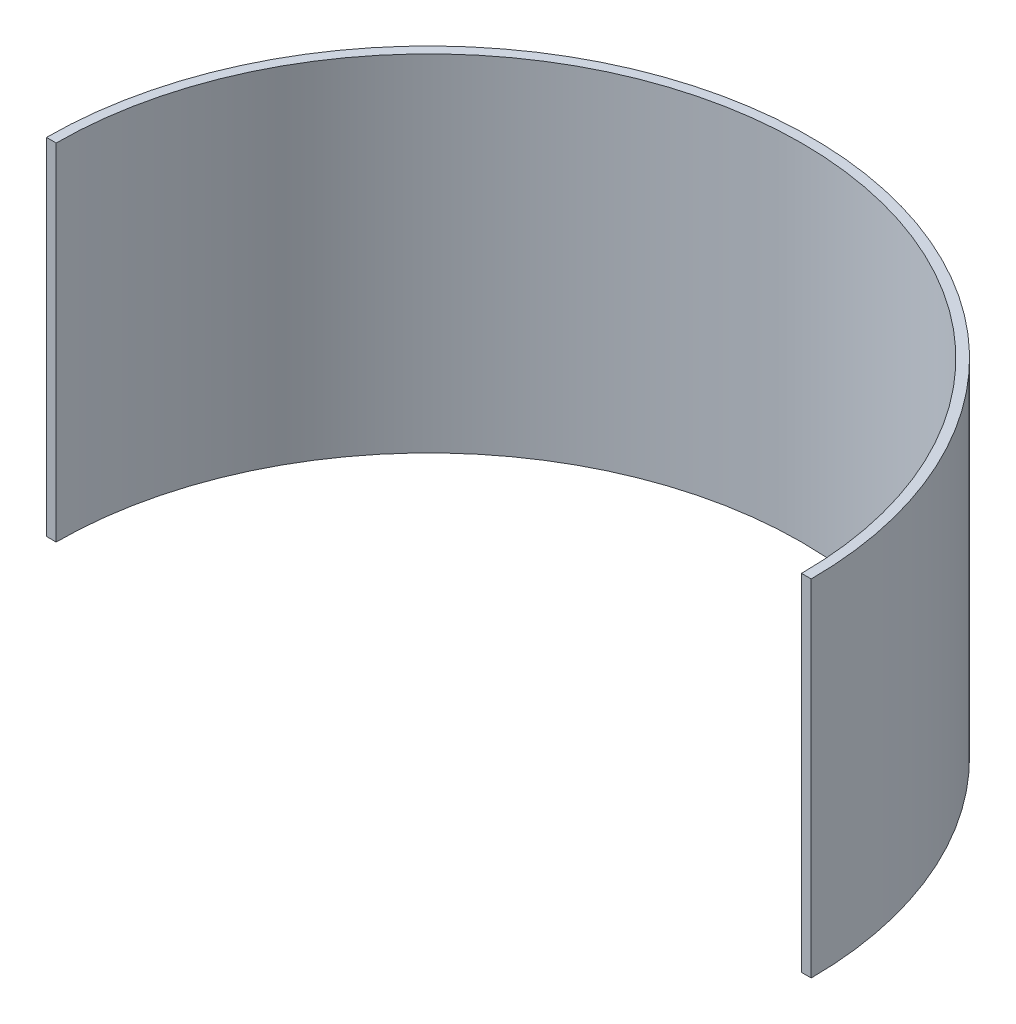
ISO-10303-21;
HEADER;
FILE_DESCRIPTION(('STEP AP214'),'2;1');
FILE_NAME('part.step','',(''),(''),'','','');
FILE_SCHEMA(('AUTOMOTIVE_DESIGN { 1 0 10303 214 1 1 1 1 }'));
ENDSEC;
DATA;
#1=APPLICATION_CONTEXT('core data for automotive mechanical design processes');
#2=APPLICATION_PROTOCOL_DEFINITION('international standard','automotive_design',2000,#1);
#3=PRODUCT_CONTEXT('',#1,'mechanical');
#4=PRODUCT('Part','Part','',(#3));
#5=PRODUCT_RELATED_PRODUCT_CATEGORY('part','',(#4));
#6=PRODUCT_DEFINITION_FORMATION('','',#4);
#7=PRODUCT_DEFINITION_CONTEXT('part definition',#1,'design');
#8=PRODUCT_DEFINITION('design','',#6,#7);
#9=PRODUCT_DEFINITION_SHAPE('','',#8);
#10=(LENGTH_UNIT() NAMED_UNIT(*) SI_UNIT(.MILLI.,.METRE.));
#11=(NAMED_UNIT(*) PLANE_ANGLE_UNIT() SI_UNIT($,.RADIAN.));
#12=(NAMED_UNIT(*) SI_UNIT($,.STERADIAN.) SOLID_ANGLE_UNIT());
#13=UNCERTAINTY_MEASURE_WITH_UNIT(LENGTH_MEASURE(1.E-05),#10,'distance_accuracy_value','');
#14=(GEOMETRIC_REPRESENTATION_CONTEXT(3) GLOBAL_UNCERTAINTY_ASSIGNED_CONTEXT((#13)) GLOBAL_UNIT_ASSIGNED_CONTEXT((#10,
#11,#12)) REPRESENTATION_CONTEXT('',''));
#15=CARTESIAN_POINT('',(0.,0.,0.));
#16=DIRECTION('',(0.,0.,1.));
#17=DIRECTION('',(1.,0.,0.));
#18=AXIS2_PLACEMENT_3D('',#15,#16,#17);
#19=CARTESIAN_POINT('',(0.,24.9,0.));
#20=DIRECTION('',(0.,-1.,0.));
#21=DIRECTION('',(0.,0.,-1.));
#22=AXIS2_PLACEMENT_3D('',#19,#20,#21);
#23=CYLINDRICAL_SURFACE('',#22,26.852);
#24=CARTESIAN_POINT('',(0.,0.,0.));
#25=DIRECTION('',(0.,1.,0.));
#26=DIRECTION('',(0.,0.,1.));
#27=AXIS2_PLACEMENT_3D('',#24,#25,#26);
#28=CIRCLE('',#27,26.852);
#29=CARTESIAN_POINT('',(26.852,0.,0.));
#30=VERTEX_POINT('',#29);
#31=CARTESIAN_POINT('',(-26.852,0.,0.));
#32=VERTEX_POINT('',#31);
#33=EDGE_CURVE('E111',#30,#32,#28,.T.);
#34=ORIENTED_EDGE('',*,*,#33,.F.);
#35=DIRECTION('',(0.,-1.,0.));
#36=VECTOR('',#35,1.);
#37=CARTESIAN_POINT('',(26.852,24.9,0.));
#38=LINE('',#37,#36);
#39=CARTESIAN_POINT('',(26.852,24.9,0.));
#40=VERTEX_POINT('',#39);
#41=EDGE_CURVE('E11',#40,#30,#38,.T.);
#42=ORIENTED_EDGE('',*,*,#41,.F.);
#43=CARTESIAN_POINT('',(0.,24.9,0.));
#44=DIRECTION('',(0.,1.,0.));
#45=DIRECTION('',(0.,0.,1.));
#46=AXIS2_PLACEMENT_3D('',#43,#44,#45);
#47=CIRCLE('',#46,26.852);
#48=CARTESIAN_POINT('',(-26.852,24.9,0.));
#49=VERTEX_POINT('',#48);
#50=EDGE_CURVE('E96',#40,#49,#47,.T.);
#51=ORIENTED_EDGE('',*,*,#50,.T.);
#52=DIRECTION('',(0.,-1.,0.));
#53=VECTOR('',#52,1.);
#54=CARTESIAN_POINT('',(-26.852,24.9,0.));
#55=LINE('',#54,#53);
#56=EDGE_CURVE('E85',#49,#32,#55,.T.);
#57=ORIENTED_EDGE('',*,*,#56,.T.);
#58=EDGE_LOOP('',(#34,#42,#51,#57));
#59=FACE_BOUND('',#58,.T.);
#60=ADVANCED_FACE('F45',(#59),#23,.F.);
#61=CARTESIAN_POINT('',(0.,24.9,0.));
#62=DIRECTION('',(0.,0.,-1.));
#63=DIRECTION('',(-1.,0.,0.));
#64=AXIS2_PLACEMENT_3D('',#61,#62,#63);
#65=PLANE('',#64);
#66=DIRECTION('',(1.,0.,0.));
#67=VECTOR('',#66,1.);
#68=CARTESIAN_POINT('',(0.,0.,0.));
#69=LINE('',#68,#67);
#70=CARTESIAN_POINT('',(27.55,0.,0.));
#71=VERTEX_POINT('',#70);
#72=EDGE_CURVE('E102',#30,#71,#69,.T.);
#73=ORIENTED_EDGE('',*,*,#72,.T.);
#74=DIRECTION('',(0.,-1.,0.));
#75=VECTOR('',#74,1.);
#76=CARTESIAN_POINT('',(27.55,24.9,0.));
#77=LINE('',#76,#75);
#78=CARTESIAN_POINT('',(27.55,24.9,0.));
#79=VERTEX_POINT('',#78);
#80=EDGE_CURVE('E54',#79,#71,#77,.T.);
#81=ORIENTED_EDGE('',*,*,#80,.F.);
#82=DIRECTION('',(1.,0.,0.));
#83=VECTOR('',#82,1.);
#84=CARTESIAN_POINT('',(0.,24.9,0.));
#85=LINE('',#84,#83);
#86=EDGE_CURVE('E91',#40,#79,#85,.T.);
#87=ORIENTED_EDGE('',*,*,#86,.F.);
#88=ORIENTED_EDGE('',*,*,#41,.T.);
#89=EDGE_LOOP('',(#73,#81,#87,#88));
#90=FACE_BOUND('',#89,.T.);
#91=ADVANCED_FACE('F100',(#90),#65,.F.);
#92=CARTESIAN_POINT('',(0.,24.9,0.));
#93=DIRECTION('',(0.,-1.,0.));
#94=DIRECTION('',(0.,0.,-1.));
#95=AXIS2_PLACEMENT_3D('',#92,#93,#94);
#96=CYLINDRICAL_SURFACE('',#95,27.55);
#97=CARTESIAN_POINT('',(0.,0.,0.));
#98=DIRECTION('',(0.,1.,0.));
#99=DIRECTION('',(0.,0.,1.));
#100=AXIS2_PLACEMENT_3D('',#97,#98,#99);
#101=CIRCLE('',#100,27.55);
#102=CARTESIAN_POINT('',(-27.55,0.,0.));
#103=VERTEX_POINT('',#102);
#104=EDGE_CURVE('E78',#71,#103,#101,.T.);
#105=ORIENTED_EDGE('',*,*,#104,.T.);
#106=DIRECTION('',(0.,-1.,0.));
#107=VECTOR('',#106,1.);
#108=CARTESIAN_POINT('',(-27.55,24.9,0.));
#109=LINE('',#108,#107);
#110=CARTESIAN_POINT('',(-27.55,24.9,0.));
#111=VERTEX_POINT('',#110);
#112=EDGE_CURVE('E104',#111,#103,#109,.T.);
#113=ORIENTED_EDGE('',*,*,#112,.F.);
#114=CARTESIAN_POINT('',(0.,24.9,0.));
#115=DIRECTION('',(0.,1.,0.));
#116=DIRECTION('',(0.,0.,1.));
#117=AXIS2_PLACEMENT_3D('',#114,#115,#116);
#118=CIRCLE('',#117,27.55);
#119=EDGE_CURVE('E95',#79,#111,#118,.T.);
#120=ORIENTED_EDGE('',*,*,#119,.F.);
#121=ORIENTED_EDGE('',*,*,#80,.T.);
#122=EDGE_LOOP('',(#105,#113,#120,#121));
#123=FACE_BOUND('',#122,.T.);
#124=ADVANCED_FACE('F105',(#123),#96,.T.);
#125=EDGE_CURVE('E117',#103,#32,#69,.T.);
#126=ORIENTED_EDGE('',*,*,#125,.T.);
#127=ORIENTED_EDGE('',*,*,#56,.F.);
#128=EDGE_CURVE('E62',#111,#49,#85,.T.);
#129=ORIENTED_EDGE('',*,*,#128,.F.);
#130=ORIENTED_EDGE('',*,*,#112,.T.);
#131=EDGE_LOOP('',(#126,#127,#129,#130));
#132=FACE_BOUND('',#131,.T.);
#133=ADVANCED_FACE('F125',(#132),#65,.F.);
#134=CARTESIAN_POINT('',(0.,24.9,0.));
#135=DIRECTION('',(0.,1.,0.));
#136=DIRECTION('',(0.,0.,1.));
#137=AXIS2_PLACEMENT_3D('',#134,#135,#136);
#138=PLANE('',#137);
#139=ORIENTED_EDGE('',*,*,#50,.F.);
#140=ORIENTED_EDGE('',*,*,#86,.T.);
#141=ORIENTED_EDGE('',*,*,#119,.T.);
#142=ORIENTED_EDGE('',*,*,#128,.T.);
#143=EDGE_LOOP('',(#139,#140,#141,#142));
#144=FACE_BOUND('',#143,.T.);
#145=ADVANCED_FACE('F93',(#144),#138,.T.);
#146=CARTESIAN_POINT('',(0.,0.,0.));
#147=DIRECTION('',(0.,1.,0.));
#148=DIRECTION('',(0.,0.,1.));
#149=AXIS2_PLACEMENT_3D('',#146,#147,#148);
#150=PLANE('',#149);
#151=ORIENTED_EDGE('',*,*,#33,.T.);
#152=ORIENTED_EDGE('',*,*,#125,.F.);
#153=ORIENTED_EDGE('',*,*,#104,.F.);
#154=ORIENTED_EDGE('',*,*,#72,.F.);
#155=EDGE_LOOP('',(#151,#152,#153,#154));
#156=FACE_BOUND('',#155,.T.);
#157=ADVANCED_FACE('F127',(#156),#150,.F.);
#158=CLOSED_SHELL('',(#60,#91,#124,#133,#145,#157));
#159=MANIFOLD_SOLID_BREP('B2',#158);
#160=ADVANCED_BREP_SHAPE_REPRESENTATION('',(#18,#159),#14);
#161=SHAPE_DEFINITION_REPRESENTATION(#9,#160);
ENDSEC;
END-ISO-10303-21;
